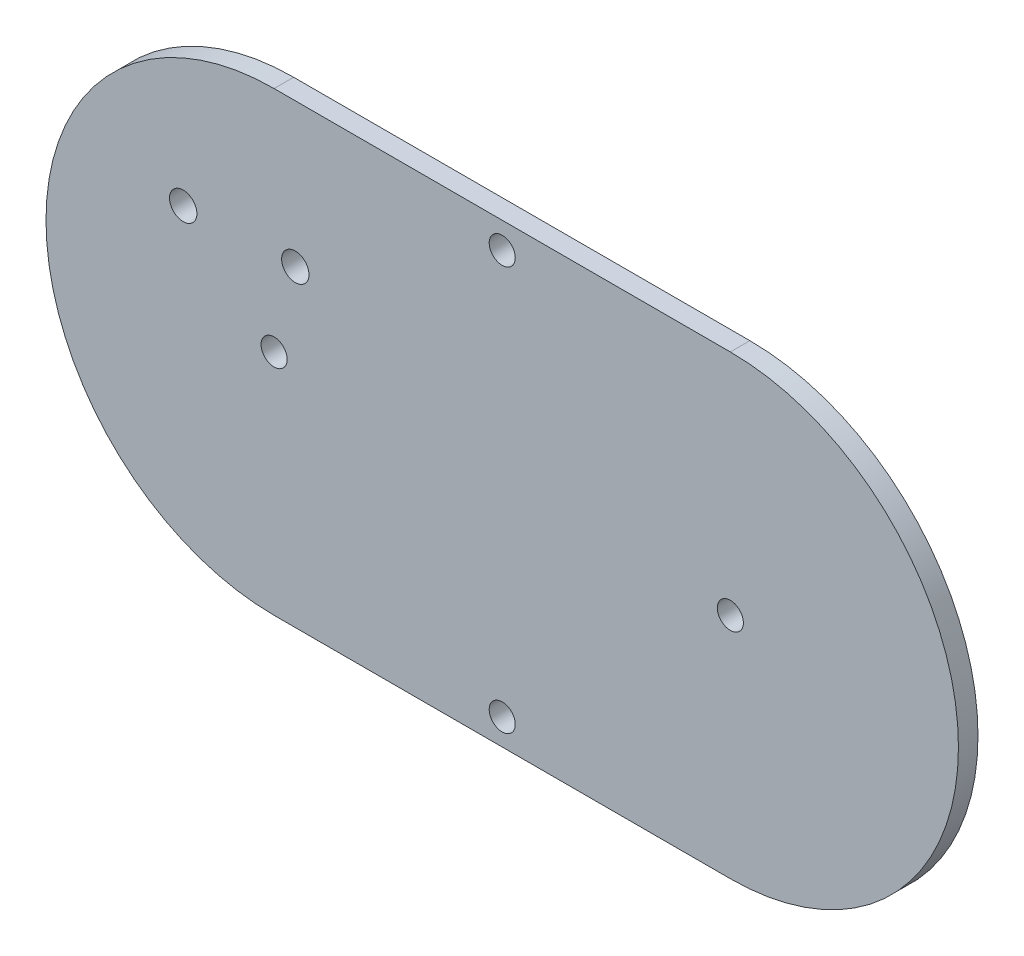
ISO-10303-21;
HEADER;
FILE_DESCRIPTION(('STEP AP214'),'2;1');
FILE_NAME('part.step','',(''),(''),'','','');
FILE_SCHEMA(('AUTOMOTIVE_DESIGN { 1 0 10303 214 1 1 1 1 }'));
ENDSEC;
DATA;
#1=APPLICATION_CONTEXT('core data for automotive mechanical design processes');
#2=APPLICATION_PROTOCOL_DEFINITION('international standard','automotive_design',2000,#1);
#3=PRODUCT_CONTEXT('',#1,'mechanical');
#4=PRODUCT('Part','Part','',(#3));
#5=PRODUCT_RELATED_PRODUCT_CATEGORY('part','',(#4));
#6=PRODUCT_DEFINITION_FORMATION('','',#4);
#7=PRODUCT_DEFINITION_CONTEXT('part definition',#1,'design');
#8=PRODUCT_DEFINITION('design','',#6,#7);
#9=PRODUCT_DEFINITION_SHAPE('','',#8);
#10=(LENGTH_UNIT() NAMED_UNIT(*) SI_UNIT(.MILLI.,.METRE.));
#11=(NAMED_UNIT(*) PLANE_ANGLE_UNIT() SI_UNIT($,.RADIAN.));
#12=(NAMED_UNIT(*) SI_UNIT($,.STERADIAN.) SOLID_ANGLE_UNIT());
#13=UNCERTAINTY_MEASURE_WITH_UNIT(LENGTH_MEASURE(1.E-05),#10,'distance_accuracy_value','');
#14=(GEOMETRIC_REPRESENTATION_CONTEXT(3) GLOBAL_UNCERTAINTY_ASSIGNED_CONTEXT((#13)) GLOBAL_UNIT_ASSIGNED_CONTEXT((#10,
#11,#12)) REPRESENTATION_CONTEXT('',''));
#15=CARTESIAN_POINT('',(0.,0.,0.));
#16=DIRECTION('',(0.,0.,1.));
#17=DIRECTION('',(1.,0.,0.));
#18=AXIS2_PLACEMENT_3D('',#15,#16,#17);
#19=CARTESIAN_POINT('',(243.514566494785,311.28732123682,3.));
#20=DIRECTION('',(0.,0.,1.));
#21=DIRECTION('',(1.,0.,0.));
#22=AXIS2_PLACEMENT_3D('',#19,#20,#21);
#23=PLANE('',#22);
#24=CARTESIAN_POINT('',(278.514566494785,342.28732123682,3.));
#25=DIRECTION('',(0.,0.,1.));
#26=DIRECTION('',(1.,0.,0.));
#27=AXIS2_PLACEMENT_3D('',#24,#25,#26);
#28=CIRCLE('',#27,2.);
#29=CARTESIAN_POINT('',(280.514566494785,342.28732123682,3.));
#30=VERTEX_POINT('',#29);
#31=EDGE_CURVE('E134',#30,#30,#28,.T.);
#32=ORIENTED_EDGE('',*,*,#31,.F.);
#33=EDGE_LOOP('',(#32));
#34=FACE_BOUND('',#33,.T.);
#35=CARTESIAN_POINT('',(246.764562224672,324.225588055534,3.));
#36=DIRECTION('',(0.,0.,1.));
#37=DIRECTION('',(1.,0.,0.));
#38=AXIS2_PLACEMENT_3D('',#35,#36,#37);
#39=CIRCLE('',#38,2.09999739448067);
#40=CARTESIAN_POINT('',(248.864559619153,324.225588055534,3.));
#41=VERTEX_POINT('',#40);
#42=EDGE_CURVE('E122',#41,#41,#39,.T.);
#43=ORIENTED_EDGE('',*,*,#42,.F.);
#44=EDGE_LOOP('',(#43));
#45=FACE_BOUND('',#44,.T.);
#46=CARTESIAN_POINT('',(243.514566494785,311.28732123682,3.));
#47=DIRECTION('',(0.,0.,1.));
#48=DIRECTION('',(1.,0.,0.));
#49=AXIS2_PLACEMENT_3D('',#46,#47,#48);
#50=CIRCLE('',#49,1.99999999999994);
#51=CARTESIAN_POINT('',(245.514566494785,311.28732123682,3.));
#52=VERTEX_POINT('',#51);
#53=EDGE_CURVE('E101',#52,#52,#50,.T.);
#54=ORIENTED_EDGE('',*,*,#53,.F.);
#55=EDGE_LOOP('',(#54));
#56=FACE_BOUND('',#55,.T.);
#57=CARTESIAN_POINT('',(243.514566494785,311.28732123682,3.));
#58=DIRECTION('',(0.,0.,1.));
#59=DIRECTION('',(1.,0.,0.));
#60=AXIS2_PLACEMENT_3D('',#57,#58,#59);
#61=CIRCLE('',#60,35.);
#62=CARTESIAN_POINT('',(243.514566494785,346.28732123682,3.));
#63=VERTEX_POINT('',#62);
#64=CARTESIAN_POINT('',(243.514566494785,276.28732123682,3.));
#65=VERTEX_POINT('',#64);
#66=EDGE_CURVE('E86',#63,#65,#61,.T.);
#67=ORIENTED_EDGE('',*,*,#66,.T.);
#68=DIRECTION('',(1.,0.,0.));
#69=VECTOR('',#68,1.);
#70=CARTESIAN_POINT('',(243.514566494785,276.28732123682,3.));
#71=LINE('',#70,#69);
#72=CARTESIAN_POINT('',(313.514566494785,276.28732123682,3.));
#73=VERTEX_POINT('',#72);
#74=EDGE_CURVE('E81',#65,#73,#71,.T.);
#75=ORIENTED_EDGE('',*,*,#74,.T.);
#76=CARTESIAN_POINT('',(313.514566494785,311.28732123682,3.));
#77=DIRECTION('',(0.,0.,1.));
#78=DIRECTION('',(-1.,0.,0.));
#79=AXIS2_PLACEMENT_3D('',#76,#77,#78);
#80=CIRCLE('',#79,35.);
#81=CARTESIAN_POINT('',(313.514566494785,346.28732123682,3.));
#82=VERTEX_POINT('',#81);
#83=EDGE_CURVE('E84',#73,#82,#80,.T.);
#84=ORIENTED_EDGE('',*,*,#83,.T.);
#85=DIRECTION('',(-1.,0.,0.));
#86=VECTOR('',#85,1.);
#87=CARTESIAN_POINT('',(243.514566494785,346.28732123682,3.));
#88=LINE('',#87,#86);
#89=EDGE_CURVE('E51',#82,#63,#88,.T.);
#90=ORIENTED_EDGE('',*,*,#89,.T.);
#91=EDGE_LOOP('',(#67,#75,#84,#90));
#92=FACE_BOUND('',#91,.T.);
#93=CARTESIAN_POINT('',(313.514566494785,311.28732123682,3.));
#94=DIRECTION('',(0.,0.,1.));
#95=DIRECTION('',(1.,0.,0.));
#96=AXIS2_PLACEMENT_3D('',#93,#94,#95);
#97=CIRCLE('',#96,2.);
#98=CARTESIAN_POINT('',(315.514566494785,311.28732123682,3.));
#99=VERTEX_POINT('',#98);
#100=EDGE_CURVE('E116',#99,#99,#97,.T.);
#101=ORIENTED_EDGE('',*,*,#100,.F.);
#102=EDGE_LOOP('',(#101));
#103=FACE_BOUND('',#102,.T.);
#104=CARTESIAN_POINT('',(229.564568055856,323.725595012849,3.));
#105=DIRECTION('',(0.,0.,1.));
#106=DIRECTION('',(1.,0.,0.));
#107=AXIS2_PLACEMENT_3D('',#104,#105,#106);
#108=CIRCLE('',#107,2.10000041832119);
#109=CARTESIAN_POINT('',(231.664568474177,323.725595012849,3.));
#110=VERTEX_POINT('',#109);
#111=EDGE_CURVE('E128',#110,#110,#108,.T.);
#112=ORIENTED_EDGE('',*,*,#111,.F.);
#113=EDGE_LOOP('',(#112));
#114=FACE_BOUND('',#113,.T.);
#115=CARTESIAN_POINT('',(278.514566494785,280.28732123682,3.));
#116=DIRECTION('',(0.,0.,1.));
#117=DIRECTION('',(-1.,0.,0.));
#118=AXIS2_PLACEMENT_3D('',#115,#116,#117);
#119=CIRCLE('',#118,2.);
#120=CARTESIAN_POINT('',(276.514566494785,280.28732123682,3.));
#121=VERTEX_POINT('',#120);
#122=EDGE_CURVE('E140',#121,#121,#119,.T.);
#123=ORIENTED_EDGE('',*,*,#122,.F.);
#124=EDGE_LOOP('',(#123));
#125=FACE_BOUND('',#124,.T.);
#126=ADVANCED_FACE('F34',(#34,#45,#56,#92,#103,#114,#125),#23,.T.);
#127=CARTESIAN_POINT('',(243.514566494785,311.28732123682,0.));
#128=DIRECTION('',(0.,0.,1.));
#129=DIRECTION('',(1.,0.,0.));
#130=AXIS2_PLACEMENT_3D('',#127,#128,#129);
#131=PLANE('',#130);
#132=CARTESIAN_POINT('',(243.514566494785,311.28732123682,0.));
#133=DIRECTION('',(0.,0.,1.));
#134=DIRECTION('',(1.,0.,0.));
#135=AXIS2_PLACEMENT_3D('',#132,#133,#134);
#136=CIRCLE('',#135,35.);
#137=CARTESIAN_POINT('',(243.514566494785,346.28732123682,0.));
#138=VERTEX_POINT('',#137);
#139=CARTESIAN_POINT('',(243.514566494785,276.28732123682,0.));
#140=VERTEX_POINT('',#139);
#141=EDGE_CURVE('E98',#138,#140,#136,.T.);
#142=ORIENTED_EDGE('',*,*,#141,.F.);
#143=DIRECTION('',(-1.,0.,0.));
#144=VECTOR('',#143,1.);
#145=CARTESIAN_POINT('',(243.514566494785,346.28732123682,0.));
#146=LINE('',#145,#144);
#147=CARTESIAN_POINT('',(313.514566494785,346.28732123682,0.));
#148=VERTEX_POINT('',#147);
#149=EDGE_CURVE('E74',#148,#138,#146,.T.);
#150=ORIENTED_EDGE('',*,*,#149,.F.);
#151=CARTESIAN_POINT('',(313.514566494785,311.28732123682,0.));
#152=DIRECTION('',(0.,0.,1.));
#153=DIRECTION('',(-1.,0.,0.));
#154=AXIS2_PLACEMENT_3D('',#151,#152,#153);
#155=CIRCLE('',#154,35.);
#156=CARTESIAN_POINT('',(313.514566494785,276.28732123682,0.));
#157=VERTEX_POINT('',#156);
#158=EDGE_CURVE('E68',#157,#148,#155,.T.);
#159=ORIENTED_EDGE('',*,*,#158,.F.);
#160=DIRECTION('',(1.,0.,0.));
#161=VECTOR('',#160,1.);
#162=CARTESIAN_POINT('',(243.514566494785,276.28732123682,0.));
#163=LINE('',#162,#161);
#164=EDGE_CURVE('E90',#140,#157,#163,.T.);
#165=ORIENTED_EDGE('',*,*,#164,.F.);
#166=EDGE_LOOP('',(#142,#150,#159,#165));
#167=FACE_BOUND('',#166,.T.);
#168=CARTESIAN_POINT('',(243.514566494785,311.28732123682,0.));
#169=DIRECTION('',(0.,0.,1.));
#170=DIRECTION('',(1.,0.,0.));
#171=AXIS2_PLACEMENT_3D('',#168,#169,#170);
#172=CIRCLE('',#171,1.99999999999994);
#173=CARTESIAN_POINT('',(245.514566494785,311.28732123682,0.));
#174=VERTEX_POINT('',#173);
#175=EDGE_CURVE('E113',#174,#174,#172,.T.);
#176=ORIENTED_EDGE('',*,*,#175,.T.);
#177=EDGE_LOOP('',(#176));
#178=FACE_BOUND('',#177,.T.);
#179=CARTESIAN_POINT('',(313.514566494785,311.28732123682,0.));
#180=DIRECTION('',(0.,0.,1.));
#181=DIRECTION('',(1.,0.,0.));
#182=AXIS2_PLACEMENT_3D('',#179,#180,#181);
#183=CIRCLE('',#182,2.);
#184=CARTESIAN_POINT('',(315.514566494785,311.28732123682,0.));
#185=VERTEX_POINT('',#184);
#186=EDGE_CURVE('E119',#185,#185,#183,.T.);
#187=ORIENTED_EDGE('',*,*,#186,.T.);
#188=EDGE_LOOP('',(#187));
#189=FACE_BOUND('',#188,.T.);
#190=CARTESIAN_POINT('',(246.764562224672,324.225588055534,0.));
#191=DIRECTION('',(0.,0.,1.));
#192=DIRECTION('',(1.,0.,0.));
#193=AXIS2_PLACEMENT_3D('',#190,#191,#192);
#194=CIRCLE('',#193,2.09999739448067);
#195=CARTESIAN_POINT('',(248.864559619153,324.225588055534,0.));
#196=VERTEX_POINT('',#195);
#197=EDGE_CURVE('E125',#196,#196,#194,.T.);
#198=ORIENTED_EDGE('',*,*,#197,.T.);
#199=EDGE_LOOP('',(#198));
#200=FACE_BOUND('',#199,.T.);
#201=CARTESIAN_POINT('',(229.564568055856,323.725595012849,0.));
#202=DIRECTION('',(0.,0.,1.));
#203=DIRECTION('',(1.,0.,0.));
#204=AXIS2_PLACEMENT_3D('',#201,#202,#203);
#205=CIRCLE('',#204,2.10000041832119);
#206=CARTESIAN_POINT('',(231.664568474177,323.725595012849,0.));
#207=VERTEX_POINT('',#206);
#208=EDGE_CURVE('E131',#207,#207,#205,.T.);
#209=ORIENTED_EDGE('',*,*,#208,.T.);
#210=EDGE_LOOP('',(#209));
#211=FACE_BOUND('',#210,.T.);
#212=CARTESIAN_POINT('',(278.514566494785,342.28732123682,0.));
#213=DIRECTION('',(0.,0.,1.));
#214=DIRECTION('',(1.,0.,0.));
#215=AXIS2_PLACEMENT_3D('',#212,#213,#214);
#216=CIRCLE('',#215,2.);
#217=CARTESIAN_POINT('',(280.514566494785,342.28732123682,0.));
#218=VERTEX_POINT('',#217);
#219=EDGE_CURVE('E137',#218,#218,#216,.T.);
#220=ORIENTED_EDGE('',*,*,#219,.T.);
#221=EDGE_LOOP('',(#220));
#222=FACE_BOUND('',#221,.T.);
#223=CARTESIAN_POINT('',(278.514566494785,280.28732123682,0.));
#224=DIRECTION('',(0.,0.,1.));
#225=DIRECTION('',(-1.,0.,0.));
#226=AXIS2_PLACEMENT_3D('',#223,#224,#225);
#227=CIRCLE('',#226,2.);
#228=CARTESIAN_POINT('',(276.514566494785,280.28732123682,0.));
#229=VERTEX_POINT('',#228);
#230=EDGE_CURVE('E143',#229,#229,#227,.T.);
#231=ORIENTED_EDGE('',*,*,#230,.T.);
#232=EDGE_LOOP('',(#231));
#233=FACE_BOUND('',#232,.T.);
#234=ADVANCED_FACE('F109',(#167,#178,#189,#200,#211,#222,#233),#131,.F.);
#235=CARTESIAN_POINT('',(243.514566494785,311.28732123682,3.));
#236=DIRECTION('',(0.,0.,-1.));
#237=DIRECTION('',(-1.,0.,0.));
#238=AXIS2_PLACEMENT_3D('',#235,#236,#237);
#239=CYLINDRICAL_SURFACE('',#238,35.);
#240=ORIENTED_EDGE('',*,*,#141,.T.);
#241=DIRECTION('',(0.,0.,-1.));
#242=VECTOR('',#241,1.);
#243=CARTESIAN_POINT('',(243.514566494785,276.28732123682,3.));
#244=LINE('',#243,#242);
#245=EDGE_CURVE('E11',#65,#140,#244,.T.);
#246=ORIENTED_EDGE('',*,*,#245,.F.);
#247=ORIENTED_EDGE('',*,*,#66,.F.);
#248=DIRECTION('',(0.,0.,-1.));
#249=VECTOR('',#248,1.);
#250=CARTESIAN_POINT('',(243.514566494785,346.28732123682,3.));
#251=LINE('',#250,#249);
#252=EDGE_CURVE('E94',#63,#138,#251,.T.);
#253=ORIENTED_EDGE('',*,*,#252,.T.);
#254=EDGE_LOOP('',(#240,#246,#247,#253));
#255=FACE_BOUND('',#254,.T.);
#256=ADVANCED_FACE('F36',(#255),#239,.T.);
#257=CARTESIAN_POINT('',(243.514566494785,276.28732123682,3.));
#258=DIRECTION('',(0.,1.,0.));
#259=DIRECTION('',(0.,0.,1.));
#260=AXIS2_PLACEMENT_3D('',#257,#258,#259);
#261=PLANE('',#260);
#262=ORIENTED_EDGE('',*,*,#164,.T.);
#263=DIRECTION('',(0.,0.,-1.));
#264=VECTOR('',#263,1.);
#265=CARTESIAN_POINT('',(313.514566494785,276.28732123682,3.));
#266=LINE('',#265,#264);
#267=EDGE_CURVE('E43',#73,#157,#266,.T.);
#268=ORIENTED_EDGE('',*,*,#267,.F.);
#269=ORIENTED_EDGE('',*,*,#74,.F.);
#270=ORIENTED_EDGE('',*,*,#245,.T.);
#271=EDGE_LOOP('',(#262,#268,#269,#270));
#272=FACE_BOUND('',#271,.T.);
#273=ADVANCED_FACE('F89',(#272),#261,.F.);
#274=CARTESIAN_POINT('',(313.514566494785,311.28732123682,3.));
#275=DIRECTION('',(0.,0.,-1.));
#276=DIRECTION('',(-1.,0.,0.));
#277=AXIS2_PLACEMENT_3D('',#274,#275,#276);
#278=CYLINDRICAL_SURFACE('',#277,35.);
#279=ORIENTED_EDGE('',*,*,#158,.T.);
#280=DIRECTION('',(0.,0.,-1.));
#281=VECTOR('',#280,1.);
#282=CARTESIAN_POINT('',(313.514566494785,346.28732123682,3.));
#283=LINE('',#282,#281);
#284=EDGE_CURVE('E91',#82,#148,#283,.T.);
#285=ORIENTED_EDGE('',*,*,#284,.F.);
#286=ORIENTED_EDGE('',*,*,#83,.F.);
#287=ORIENTED_EDGE('',*,*,#267,.T.);
#288=EDGE_LOOP('',(#279,#285,#286,#287));
#289=FACE_BOUND('',#288,.T.);
#290=ADVANCED_FACE('F92',(#289),#278,.T.);
#291=CARTESIAN_POINT('',(243.514566494785,346.28732123682,3.));
#292=DIRECTION('',(0.,-1.,0.));
#293=DIRECTION('',(1.,0.,0.));
#294=AXIS2_PLACEMENT_3D('',#291,#292,#293);
#295=PLANE('',#294);
#296=ORIENTED_EDGE('',*,*,#149,.T.);
#297=ORIENTED_EDGE('',*,*,#252,.F.);
#298=ORIENTED_EDGE('',*,*,#89,.F.);
#299=ORIENTED_EDGE('',*,*,#284,.T.);
#300=EDGE_LOOP('',(#296,#297,#298,#299));
#301=FACE_BOUND('',#300,.T.);
#302=ADVANCED_FACE('F106',(#301),#295,.F.);
#303=CARTESIAN_POINT('',(243.514566494785,311.28732123682,3.));
#304=DIRECTION('',(0.,0.,-1.));
#305=DIRECTION('',(-1.,0.,0.));
#306=AXIS2_PLACEMENT_3D('',#303,#304,#305);
#307=CYLINDRICAL_SURFACE('',#306,1.99999999999994);
#308=ORIENTED_EDGE('',*,*,#53,.T.);
#309=EDGE_LOOP('',(#308));
#310=FACE_BOUND('',#309,.T.);
#311=ORIENTED_EDGE('',*,*,#175,.F.);
#312=EDGE_LOOP('',(#311));
#313=FACE_BOUND('',#312,.T.);
#314=ADVANCED_FACE('F162',(#310,#313),#307,.F.);
#315=CARTESIAN_POINT('',(313.514566494785,311.28732123682,3.));
#316=DIRECTION('',(0.,0.,-1.));
#317=DIRECTION('',(-1.,0.,0.));
#318=AXIS2_PLACEMENT_3D('',#315,#316,#317);
#319=CYLINDRICAL_SURFACE('',#318,2.);
#320=ORIENTED_EDGE('',*,*,#100,.T.);
#321=EDGE_LOOP('',(#320));
#322=FACE_BOUND('',#321,.T.);
#323=ORIENTED_EDGE('',*,*,#186,.F.);
#324=EDGE_LOOP('',(#323));
#325=FACE_BOUND('',#324,.T.);
#326=ADVANCED_FACE('F208',(#322,#325),#319,.F.);
#327=CARTESIAN_POINT('',(246.764562224672,324.225588055534,3.));
#328=DIRECTION('',(0.,0.,-1.));
#329=DIRECTION('',(-1.,0.,0.));
#330=AXIS2_PLACEMENT_3D('',#327,#328,#329);
#331=CYLINDRICAL_SURFACE('',#330,2.09999739448067);
#332=ORIENTED_EDGE('',*,*,#42,.T.);
#333=EDGE_LOOP('',(#332));
#334=FACE_BOUND('',#333,.T.);
#335=ORIENTED_EDGE('',*,*,#197,.F.);
#336=EDGE_LOOP('',(#335));
#337=FACE_BOUND('',#336,.T.);
#338=ADVANCED_FACE('F216',(#334,#337),#331,.F.);
#339=CARTESIAN_POINT('',(229.564568055856,323.725595012849,3.));
#340=DIRECTION('',(0.,0.,-1.));
#341=DIRECTION('',(-1.,0.,0.));
#342=AXIS2_PLACEMENT_3D('',#339,#340,#341);
#343=CYLINDRICAL_SURFACE('',#342,2.10000041832119);
#344=ORIENTED_EDGE('',*,*,#111,.T.);
#345=EDGE_LOOP('',(#344));
#346=FACE_BOUND('',#345,.T.);
#347=ORIENTED_EDGE('',*,*,#208,.F.);
#348=EDGE_LOOP('',(#347));
#349=FACE_BOUND('',#348,.T.);
#350=ADVANCED_FACE('F224',(#346,#349),#343,.F.);
#351=CARTESIAN_POINT('',(278.514566494785,342.28732123682,3.));
#352=DIRECTION('',(0.,0.,-1.));
#353=DIRECTION('',(-1.,0.,0.));
#354=AXIS2_PLACEMENT_3D('',#351,#352,#353);
#355=CYLINDRICAL_SURFACE('',#354,2.);
#356=ORIENTED_EDGE('',*,*,#31,.T.);
#357=EDGE_LOOP('',(#356));
#358=FACE_BOUND('',#357,.T.);
#359=ORIENTED_EDGE('',*,*,#219,.F.);
#360=EDGE_LOOP('',(#359));
#361=FACE_BOUND('',#360,.T.);
#362=ADVANCED_FACE('F233',(#358,#361),#355,.F.);
#363=CARTESIAN_POINT('',(278.514566494785,280.28732123682,3.));
#364=DIRECTION('',(0.,0.,-1.));
#365=DIRECTION('',(-1.,0.,0.));
#366=AXIS2_PLACEMENT_3D('',#363,#364,#365);
#367=CYLINDRICAL_SURFACE('',#366,2.);
#368=ORIENTED_EDGE('',*,*,#122,.T.);
#369=EDGE_LOOP('',(#368));
#370=FACE_BOUND('',#369,.T.);
#371=ORIENTED_EDGE('',*,*,#230,.F.);
#372=EDGE_LOOP('',(#371));
#373=FACE_BOUND('',#372,.T.);
#374=ADVANCED_FACE('F149',(#370,#373),#367,.F.);
#375=CLOSED_SHELL('',(#126,#234,#256,#273,#290,#302,#314,#326,#338,#350,#362,#374));
#376=MANIFOLD_SOLID_BREP('B2',#375);
#377=ADVANCED_BREP_SHAPE_REPRESENTATION('',(#18,#376),#14);
#378=SHAPE_DEFINITION_REPRESENTATION(#9,#377);
ENDSEC;
END-ISO-10303-21;
